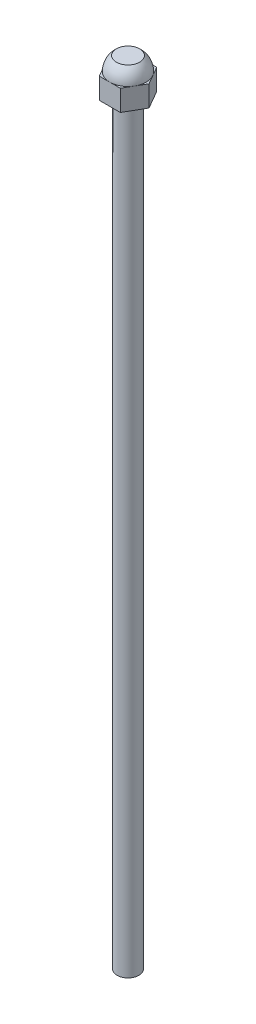
ISO-10303-21;
HEADER;
FILE_DESCRIPTION(('STEP AP214'),'2;1');
FILE_NAME('part.step','',(''),(''),'','','');
FILE_SCHEMA(('AUTOMOTIVE_DESIGN { 1 0 10303 214 1 1 1 1 }'));
ENDSEC;
DATA;
#1=APPLICATION_CONTEXT('core data for automotive mechanical design processes');
#2=APPLICATION_PROTOCOL_DEFINITION('international standard','automotive_design',2000,#1);
#3=PRODUCT_CONTEXT('',#1,'mechanical');
#4=PRODUCT('Part','Part','',(#3));
#5=PRODUCT_RELATED_PRODUCT_CATEGORY('part','',(#4));
#6=PRODUCT_DEFINITION_FORMATION('','',#4);
#7=PRODUCT_DEFINITION_CONTEXT('part definition',#1,'design');
#8=PRODUCT_DEFINITION('design','',#6,#7);
#9=PRODUCT_DEFINITION_SHAPE('','',#8);
#10=(LENGTH_UNIT() NAMED_UNIT(*) SI_UNIT(.MILLI.,.METRE.));
#11=(NAMED_UNIT(*) PLANE_ANGLE_UNIT() SI_UNIT($,.RADIAN.));
#12=(NAMED_UNIT(*) SI_UNIT($,.STERADIAN.) SOLID_ANGLE_UNIT());
#13=UNCERTAINTY_MEASURE_WITH_UNIT(LENGTH_MEASURE(1.E-05),#10,'distance_accuracy_value','');
#14=(GEOMETRIC_REPRESENTATION_CONTEXT(3) GLOBAL_UNCERTAINTY_ASSIGNED_CONTEXT((#13)) GLOBAL_UNIT_ASSIGNED_CONTEXT((#10,
#11,#12)) REPRESENTATION_CONTEXT('',''));
#15=CARTESIAN_POINT('',(0.,0.,0.));
#16=DIRECTION('',(0.,0.,1.));
#17=DIRECTION('',(1.,0.,0.));
#18=AXIS2_PLACEMENT_3D('',#15,#16,#17);
#19=CARTESIAN_POINT('',(0.,277.5,0.));
#20=DIRECTION('',(0.,1.,0.));
#21=DIRECTION('',(0.,0.,1.));
#22=AXIS2_PLACEMENT_3D('',#19,#20,#21);
#23=PLANE('',#22);
#24=CARTESIAN_POINT('',(0.,277.5,0.));
#25=DIRECTION('',(0.,1.,0.));
#26=DIRECTION('',(-1.,0.,0.));
#27=AXIS2_PLACEMENT_3D('',#24,#25,#26);
#28=CIRCLE('',#27,6.5);
#29=CARTESIAN_POINT('',(-5.62916512459889,277.5,3.24999999999995));
#30=VERTEX_POINT('',#29);
#31=CARTESIAN_POINT('',(0.,277.5,6.5));
#32=VERTEX_POINT('',#31);
#33=EDGE_CURVE('E46',#30,#32,#28,.T.);
#34=ORIENTED_EDGE('',*,*,#33,.F.);
#35=DIRECTION('',(0.5,0.,0.866025403784439));
#36=VECTOR('',#35,1.);
#37=CARTESIAN_POINT('',(-7.50555349946514,277.5,0.));
#38=LINE('',#37,#36);
#39=CARTESIAN_POINT('',(-3.75277674973257,277.5,6.5));
#40=VERTEX_POINT('',#39);
#41=EDGE_CURVE('E114',#30,#40,#38,.T.);
#42=ORIENTED_EDGE('',*,*,#41,.T.);
#43=DIRECTION('',(1.,0.,0.));
#44=VECTOR('',#43,1.);
#45=CARTESIAN_POINT('',(-3.75277674973257,277.5,6.5));
#46=LINE('',#45,#44);
#47=EDGE_CURVE('E126',#40,#32,#46,.T.);
#48=ORIENTED_EDGE('',*,*,#47,.T.);
#49=EDGE_LOOP('',(#34,#42,#48));
#50=FACE_BOUND('',#49,.T.);
#51=ADVANCED_FACE('F35',(#50),#23,.T.);
#52=CARTESIAN_POINT('',(5.62916512459886,277.5,3.24999999999998));
#53=VERTEX_POINT('',#52);
#54=EDGE_CURVE('E11',#32,#53,#28,.T.);
#55=ORIENTED_EDGE('',*,*,#54,.F.);
#56=CARTESIAN_POINT('',(3.75277674973257,277.5,6.5));
#57=VERTEX_POINT('',#56);
#58=EDGE_CURVE('E113',#32,#57,#46,.T.);
#59=ORIENTED_EDGE('',*,*,#58,.T.);
#60=DIRECTION('',(0.5,0.,-0.866025403784439));
#61=VECTOR('',#60,1.);
#62=CARTESIAN_POINT('',(3.75277674973257,277.5,6.5));
#63=LINE('',#62,#61);
#64=EDGE_CURVE('E140',#57,#53,#63,.T.);
#65=ORIENTED_EDGE('',*,*,#64,.T.);
#66=EDGE_LOOP('',(#55,#59,#65));
#67=FACE_BOUND('',#66,.T.);
#68=ADVANCED_FACE('F200',(#67),#23,.T.);
#69=CARTESIAN_POINT('',(5.62916512459882,277.5,-3.25000000000005));
#70=VERTEX_POINT('',#69);
#71=EDGE_CURVE('E44',#53,#70,#28,.T.);
#72=ORIENTED_EDGE('',*,*,#71,.F.);
#73=CARTESIAN_POINT('',(7.50555349946513,277.5,0.));
#74=VERTEX_POINT('',#73);
#75=EDGE_CURVE('E143',#53,#74,#63,.T.);
#76=ORIENTED_EDGE('',*,*,#75,.T.);
#77=DIRECTION('',(-0.5,0.,-0.866025403784439));
#78=VECTOR('',#77,1.);
#79=CARTESIAN_POINT('',(7.50555349946513,277.5,0.));
#80=LINE('',#79,#78);
#81=EDGE_CURVE('E144',#74,#70,#80,.T.);
#82=ORIENTED_EDGE('',*,*,#81,.T.);
#83=EDGE_LOOP('',(#72,#76,#82));
#84=FACE_BOUND('',#83,.T.);
#85=ADVANCED_FACE('F205',(#84),#23,.T.);
#86=CARTESIAN_POINT('',(0.,277.5,-6.5));
#87=VERTEX_POINT('',#86);
#88=EDGE_CURVE('E134',#70,#87,#28,.T.);
#89=ORIENTED_EDGE('',*,*,#88,.F.);
#90=CARTESIAN_POINT('',(3.75277674973256,277.5,-6.5));
#91=VERTEX_POINT('',#90);
#92=EDGE_CURVE('E142',#70,#91,#80,.T.);
#93=ORIENTED_EDGE('',*,*,#92,.T.);
#94=DIRECTION('',(-1.,0.,0.));
#95=VECTOR('',#94,1.);
#96=CARTESIAN_POINT('',(3.75277674973256,277.5,-6.5));
#97=LINE('',#96,#95);
#98=EDGE_CURVE('E148',#91,#87,#97,.T.);
#99=ORIENTED_EDGE('',*,*,#98,.T.);
#100=EDGE_LOOP('',(#89,#93,#99));
#101=FACE_BOUND('',#100,.T.);
#102=ADVANCED_FACE('F220',(#101),#23,.T.);
#103=CARTESIAN_POINT('',(-5.62916512459884,277.5,-3.25000000000002));
#104=VERTEX_POINT('',#103);
#105=EDGE_CURVE('E132',#87,#104,#28,.T.);
#106=ORIENTED_EDGE('',*,*,#105,.F.);
#107=CARTESIAN_POINT('',(-3.75277674973257,277.5,-6.5));
#108=VERTEX_POINT('',#107);
#109=EDGE_CURVE('E147',#87,#108,#97,.T.);
#110=ORIENTED_EDGE('',*,*,#109,.T.);
#111=DIRECTION('',(-0.5,0.,0.866025403784439));
#112=VECTOR('',#111,1.);
#113=CARTESIAN_POINT('',(-3.75277674973257,277.5,-6.5));
#114=LINE('',#113,#112);
#115=EDGE_CURVE('E124',#108,#104,#114,.T.);
#116=ORIENTED_EDGE('',*,*,#115,.T.);
#117=EDGE_LOOP('',(#106,#110,#116));
#118=FACE_BOUND('',#117,.T.);
#119=ADVANCED_FACE('F197',(#118),#23,.T.);
#120=CARTESIAN_POINT('',(0.,270.,0.));
#121=DIRECTION('',(0.,-1.,0.));
#122=DIRECTION('',(0.,0.,-1.));
#123=AXIS2_PLACEMENT_3D('',#120,#121,#122);
#124=CYLINDRICAL_SURFACE('',#123,3.9);
#125=CARTESIAN_POINT('',(0.,270.,0.));
#126=DIRECTION('',(0.,1.,0.));
#127=DIRECTION('',(0.,0.,1.));
#128=AXIS2_PLACEMENT_3D('',#125,#126,#127);
#129=CIRCLE('',#128,3.9);
#130=CARTESIAN_POINT('',(0.,270.,3.9));
#131=VERTEX_POINT('',#130);
#132=EDGE_CURVE('E133',#131,#131,#129,.T.);
#133=ORIENTED_EDGE('',*,*,#132,.F.);
#134=EDGE_LOOP('',(#133));
#135=FACE_BOUND('',#134,.T.);
#136=CARTESIAN_POINT('',(0.,0.,0.));
#137=DIRECTION('',(0.,1.,0.));
#138=DIRECTION('',(0.,0.,1.));
#139=AXIS2_PLACEMENT_3D('',#136,#137,#138);
#140=CIRCLE('',#139,3.9);
#141=CARTESIAN_POINT('',(0.,0.,3.9));
#142=VERTEX_POINT('',#141);
#143=EDGE_CURVE('E39',#142,#142,#140,.T.);
#144=ORIENTED_EDGE('',*,*,#143,.T.);
#145=EDGE_LOOP('',(#144));
#146=FACE_BOUND('',#145,.T.);
#147=ADVANCED_FACE('F37',(#135,#146),#124,.T.);
#148=CARTESIAN_POINT('',(0.,0.,0.));
#149=DIRECTION('',(0.,1.,0.));
#150=DIRECTION('',(0.,0.,1.));
#151=AXIS2_PLACEMENT_3D('',#148,#149,#150);
#152=PLANE('',#151);
#153=ORIENTED_EDGE('',*,*,#143,.F.);
#154=EDGE_LOOP('',(#153));
#155=FACE_BOUND('',#154,.T.);
#156=ADVANCED_FACE('F187',(#155),#152,.F.);
#157=CARTESIAN_POINT('',(3.75277674973257,277.5,6.5));
#158=DIRECTION('',(-0.866025403784439,0.,-0.5));
#159=DIRECTION('',(-0.5,0.,0.866025403784439));
#160=AXIS2_PLACEMENT_3D('',#157,#158,#159);
#161=PLANE('',#160);
#162=DIRECTION('',(0.5,0.,-0.866025403784439));
#163=VECTOR('',#162,1.);
#164=CARTESIAN_POINT('',(3.75277674973257,270.,6.5));
#165=LINE('',#164,#163);
#166=CARTESIAN_POINT('',(3.75277674973257,270.,6.5));
#167=VERTEX_POINT('',#166);
#168=CARTESIAN_POINT('',(7.50555349946513,270.,0.));
#169=VERTEX_POINT('',#168);
#170=EDGE_CURVE('E139',#167,#169,#165,.T.);
#171=ORIENTED_EDGE('',*,*,#170,.T.);
#172=DIRECTION('',(0.,-1.,0.));
#173=VECTOR('',#172,1.);
#174=CARTESIAN_POINT('',(7.50555349946513,277.5,0.));
#175=LINE('',#174,#173);
#176=EDGE_CURVE('E178',#74,#169,#175,.T.);
#177=ORIENTED_EDGE('',*,*,#176,.F.);
#178=ORIENTED_EDGE('',*,*,#75,.F.);
#179=ORIENTED_EDGE('',*,*,#64,.F.);
#180=DIRECTION('',(0.,-1.,0.));
#181=VECTOR('',#180,1.);
#182=CARTESIAN_POINT('',(3.75277674973257,277.5,6.5));
#183=LINE('',#182,#181);
#184=EDGE_CURVE('E154',#57,#167,#183,.T.);
#185=ORIENTED_EDGE('',*,*,#184,.T.);
#186=EDGE_LOOP('',(#171,#177,#178,#179,#185));
#187=FACE_BOUND('',#186,.T.);
#188=ADVANCED_FACE('F189',(#187),#161,.F.);
#189=CARTESIAN_POINT('',(7.50555349946513,277.5,0.));
#190=DIRECTION('',(-0.866025403784438,0.,0.5));
#191=DIRECTION('',(0.5,0.,0.866025403784439));
#192=AXIS2_PLACEMENT_3D('',#189,#190,#191);
#193=PLANE('',#192);
#194=DIRECTION('',(-0.5,0.,-0.866025403784439));
#195=VECTOR('',#194,1.);
#196=CARTESIAN_POINT('',(7.50555349946513,270.,0.));
#197=LINE('',#196,#195);
#198=CARTESIAN_POINT('',(3.75277674973256,270.,-6.5));
#199=VERTEX_POINT('',#198);
#200=EDGE_CURVE('E157',#169,#199,#197,.T.);
#201=ORIENTED_EDGE('',*,*,#200,.T.);
#202=DIRECTION('',(0.,-1.,0.));
#203=VECTOR('',#202,1.);
#204=CARTESIAN_POINT('',(3.75277674973256,277.5,-6.5));
#205=LINE('',#204,#203);
#206=EDGE_CURVE('E175',#91,#199,#205,.T.);
#207=ORIENTED_EDGE('',*,*,#206,.F.);
#208=ORIENTED_EDGE('',*,*,#92,.F.);
#209=ORIENTED_EDGE('',*,*,#81,.F.);
#210=ORIENTED_EDGE('',*,*,#176,.T.);
#211=EDGE_LOOP('',(#201,#207,#208,#209,#210));
#212=FACE_BOUND('',#211,.T.);
#213=ADVANCED_FACE('F194',(#212),#193,.F.);
#214=CARTESIAN_POINT('',(3.75277674973256,277.5,-6.5));
#215=DIRECTION('',(0.,0.,1.));
#216=DIRECTION('',(1.,0.,0.));
#217=AXIS2_PLACEMENT_3D('',#214,#215,#216);
#218=PLANE('',#217);
#219=DIRECTION('',(-1.,0.,0.));
#220=VECTOR('',#219,1.);
#221=CARTESIAN_POINT('',(3.75277674973256,270.,-6.5));
#222=LINE('',#221,#220);
#223=CARTESIAN_POINT('',(-3.75277674973257,270.,-6.5));
#224=VERTEX_POINT('',#223);
#225=EDGE_CURVE('E159',#199,#224,#222,.T.);
#226=ORIENTED_EDGE('',*,*,#225,.T.);
#227=DIRECTION('',(0.,-1.,0.));
#228=VECTOR('',#227,1.);
#229=CARTESIAN_POINT('',(-3.75277674973257,277.5,-6.5));
#230=LINE('',#229,#228);
#231=EDGE_CURVE('E172',#108,#224,#230,.T.);
#232=ORIENTED_EDGE('',*,*,#231,.F.);
#233=ORIENTED_EDGE('',*,*,#109,.F.);
#234=ORIENTED_EDGE('',*,*,#98,.F.);
#235=ORIENTED_EDGE('',*,*,#206,.T.);
#236=EDGE_LOOP('',(#226,#232,#233,#234,#235));
#237=FACE_BOUND('',#236,.T.);
#238=ADVANCED_FACE('F231',(#237),#218,.F.);
#239=CARTESIAN_POINT('',(-3.75277674973257,277.5,-6.5));
#240=DIRECTION('',(0.866025403784439,0.,0.5));
#241=DIRECTION('',(0.5,0.,-0.866025403784439));
#242=AXIS2_PLACEMENT_3D('',#239,#240,#241);
#243=PLANE('',#242);
#244=DIRECTION('',(-0.5,0.,0.866025403784439));
#245=VECTOR('',#244,1.);
#246=CARTESIAN_POINT('',(-3.75277674973257,270.,-6.5));
#247=LINE('',#246,#245);
#248=CARTESIAN_POINT('',(-7.50555349946514,270.,0.));
#249=VERTEX_POINT('',#248);
#250=EDGE_CURVE('E161',#224,#249,#247,.T.);
#251=ORIENTED_EDGE('',*,*,#250,.T.);
#252=DIRECTION('',(0.,-1.,0.));
#253=VECTOR('',#252,1.);
#254=CARTESIAN_POINT('',(-7.50555349946514,277.5,0.));
#255=LINE('',#254,#253);
#256=CARTESIAN_POINT('',(-7.50555349946514,277.5,0.));
#257=VERTEX_POINT('',#256);
#258=EDGE_CURVE('E170',#257,#249,#255,.T.);
#259=ORIENTED_EDGE('',*,*,#258,.F.);
#260=EDGE_CURVE('E109',#104,#257,#114,.T.);
#261=ORIENTED_EDGE('',*,*,#260,.F.);
#262=ORIENTED_EDGE('',*,*,#115,.F.);
#263=ORIENTED_EDGE('',*,*,#231,.T.);
#264=EDGE_LOOP('',(#251,#259,#261,#262,#263));
#265=FACE_BOUND('',#264,.T.);
#266=ADVANCED_FACE('F246',(#265),#243,.F.);
#267=CARTESIAN_POINT('',(-7.50555349946514,277.5,0.));
#268=DIRECTION('',(0.866025403784438,0.,-0.5));
#269=DIRECTION('',(-0.5,0.,-0.866025403784439));
#270=AXIS2_PLACEMENT_3D('',#267,#268,#269);
#271=PLANE('',#270);
#272=DIRECTION('',(0.5,0.,0.866025403784439));
#273=VECTOR('',#272,1.);
#274=CARTESIAN_POINT('',(-7.50555349946514,270.,0.));
#275=LINE('',#274,#273);
#276=CARTESIAN_POINT('',(-3.75277674973257,270.,6.5));
#277=VERTEX_POINT('',#276);
#278=EDGE_CURVE('E163',#249,#277,#275,.T.);
#279=ORIENTED_EDGE('',*,*,#278,.T.);
#280=DIRECTION('',(0.,-1.,0.));
#281=VECTOR('',#280,1.);
#282=CARTESIAN_POINT('',(-3.75277674973257,277.5,6.5));
#283=LINE('',#282,#281);
#284=EDGE_CURVE('E120',#40,#277,#283,.T.);
#285=ORIENTED_EDGE('',*,*,#284,.F.);
#286=ORIENTED_EDGE('',*,*,#41,.F.);
#287=EDGE_CURVE('E106',#257,#30,#38,.T.);
#288=ORIENTED_EDGE('',*,*,#287,.F.);
#289=ORIENTED_EDGE('',*,*,#258,.T.);
#290=EDGE_LOOP('',(#279,#285,#286,#288,#289));
#291=FACE_BOUND('',#290,.T.);
#292=ADVANCED_FACE('F118',(#291),#271,.F.);
#293=CARTESIAN_POINT('',(-3.75277674973257,277.5,6.5));
#294=DIRECTION('',(0.,0.,-1.));
#295=DIRECTION('',(-1.,0.,0.));
#296=AXIS2_PLACEMENT_3D('',#293,#294,#295);
#297=PLANE('',#296);
#298=DIRECTION('',(1.,0.,0.));
#299=VECTOR('',#298,1.);
#300=CARTESIAN_POINT('',(-3.75277674973257,270.,6.5));
#301=LINE('',#300,#299);
#302=EDGE_CURVE('E165',#277,#167,#301,.T.);
#303=ORIENTED_EDGE('',*,*,#302,.T.);
#304=ORIENTED_EDGE('',*,*,#184,.F.);
#305=ORIENTED_EDGE('',*,*,#58,.F.);
#306=ORIENTED_EDGE('',*,*,#47,.F.);
#307=ORIENTED_EDGE('',*,*,#284,.T.);
#308=EDGE_LOOP('',(#303,#304,#305,#306,#307));
#309=FACE_BOUND('',#308,.T.);
#310=ADVANCED_FACE('F210',(#309),#297,.F.);
#311=EDGE_CURVE('E59',#104,#30,#28,.T.);
#312=ORIENTED_EDGE('',*,*,#311,.F.);
#313=ORIENTED_EDGE('',*,*,#260,.T.);
#314=ORIENTED_EDGE('',*,*,#287,.T.);
#315=EDGE_LOOP('',(#312,#313,#314));
#316=FACE_BOUND('',#315,.T.);
#317=ADVANCED_FACE('F108',(#316),#23,.T.);
#318=CARTESIAN_POINT('',(0.,270.,0.));
#319=DIRECTION('',(0.,1.,0.));
#320=DIRECTION('',(0.,0.,1.));
#321=AXIS2_PLACEMENT_3D('',#318,#319,#320);
#322=PLANE('',#321);
#323=ORIENTED_EDGE('',*,*,#132,.T.);
#324=EDGE_LOOP('',(#323));
#325=FACE_BOUND('',#324,.T.);
#326=ORIENTED_EDGE('',*,*,#170,.F.);
#327=ORIENTED_EDGE('',*,*,#302,.F.);
#328=ORIENTED_EDGE('',*,*,#278,.F.);
#329=ORIENTED_EDGE('',*,*,#250,.F.);
#330=ORIENTED_EDGE('',*,*,#225,.F.);
#331=ORIENTED_EDGE('',*,*,#200,.F.);
#332=EDGE_LOOP('',(#326,#327,#328,#329,#330,#331));
#333=FACE_BOUND('',#332,.T.);
#334=ADVANCED_FACE('F209',(#325,#333),#322,.F.);
#335=CARTESIAN_POINT('',(0.,282.5,0.));
#336=DIRECTION('',(0.,-1.,0.));
#337=DIRECTION('',(1.,0.,0.));
#338=AXIS2_PLACEMENT_3D('',#335,#336,#337);
#339=PLANE('',#338);
#340=CARTESIAN_POINT('',(0.,282.5,0.));
#341=DIRECTION('',(0.,1.,0.));
#342=DIRECTION('',(-1.,0.,0.));
#343=AXIS2_PLACEMENT_3D('',#340,#341,#342);
#344=CIRCLE('',#343,4.15331193145898);
#345=CARTESIAN_POINT('',(-4.15331193145896,282.5,0.));
#346=VERTEX_POINT('',#345);
#347=EDGE_CURVE('E128',#346,#346,#344,.T.);
#348=ORIENTED_EDGE('',*,*,#347,.T.);
#349=EDGE_LOOP('',(#348));
#350=FACE_BOUND('',#349,.T.);
#351=ADVANCED_FACE('F215',(#350),#339,.F.);
#352=CARTESIAN_POINT('',(0.,277.5,0.));
#353=DIRECTION('',(0.,1.,0.));
#354=DIRECTION('',(0.866025403784438,0.,-0.500000000000001));
#355=AXIS2_PLACEMENT_3D('',#352,#353,#354);
#356=SPHERICAL_SURFACE('',#355,6.5);
#357=ORIENTED_EDGE('',*,*,#347,.F.);
#358=EDGE_LOOP('',(#357));
#359=FACE_BOUND('',#358,.T.);
#360=ORIENTED_EDGE('',*,*,#33,.T.);
#361=ORIENTED_EDGE('',*,*,#54,.T.);
#362=ORIENTED_EDGE('',*,*,#71,.T.);
#363=ORIENTED_EDGE('',*,*,#88,.T.);
#364=ORIENTED_EDGE('',*,*,#105,.T.);
#365=ORIENTED_EDGE('',*,*,#311,.T.);
#366=EDGE_LOOP('',(#360,#361,#362,#363,#364,#365));
#367=FACE_BOUND('',#366,.T.);
#368=ADVANCED_FACE('F130',(#359,#367),#356,.T.);
#369=CLOSED_SHELL('',(#51,#68,#85,#102,#119,#147,#156,#188,#213,#238,#266,#292,#310,#317,#334,
#351,#368));
#370=MANIFOLD_SOLID_BREP('B2',#369);
#371=ADVANCED_BREP_SHAPE_REPRESENTATION('',(#18,#370),#14);
#372=SHAPE_DEFINITION_REPRESENTATION(#9,#371);
ENDSEC;
END-ISO-10303-21;
